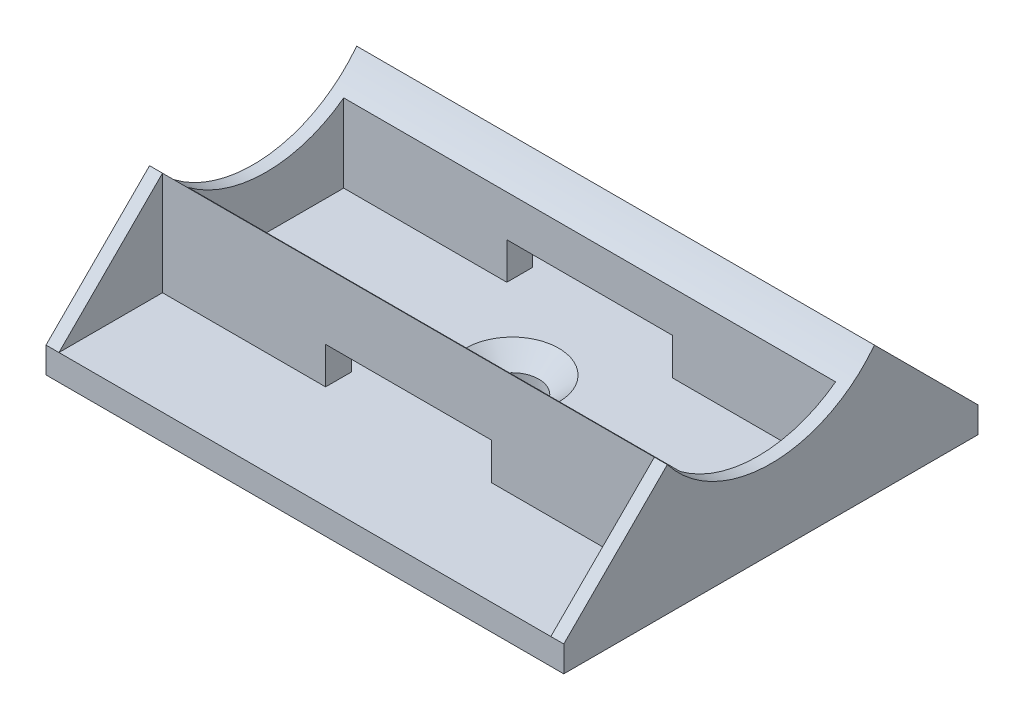
ISO-10303-21;
HEADER;
FILE_DESCRIPTION(('STEP AP214'),'2;1');
FILE_NAME('part.step','',(''),(''),'','','');
FILE_SCHEMA(('AUTOMOTIVE_DESIGN { 1 0 10303 214 1 1 1 1 }'));
ENDSEC;
DATA;
#1=APPLICATION_CONTEXT('core data for automotive mechanical design processes');
#2=APPLICATION_PROTOCOL_DEFINITION('international standard','automotive_design',2000,#1);
#3=PRODUCT_CONTEXT('',#1,'mechanical');
#4=PRODUCT('Part','Part','',(#3));
#5=PRODUCT_RELATED_PRODUCT_CATEGORY('part','',(#4));
#6=PRODUCT_DEFINITION_FORMATION('','',#4);
#7=PRODUCT_DEFINITION_CONTEXT('part definition',#1,'design');
#8=PRODUCT_DEFINITION('design','',#6,#7);
#9=PRODUCT_DEFINITION_SHAPE('','',#8);
#10=(LENGTH_UNIT() NAMED_UNIT(*) SI_UNIT(.MILLI.,.METRE.));
#11=(NAMED_UNIT(*) PLANE_ANGLE_UNIT() SI_UNIT($,.RADIAN.));
#12=(NAMED_UNIT(*) SI_UNIT($,.STERADIAN.) SOLID_ANGLE_UNIT());
#13=UNCERTAINTY_MEASURE_WITH_UNIT(LENGTH_MEASURE(1.E-05),#10,'distance_accuracy_value','');
#14=(GEOMETRIC_REPRESENTATION_CONTEXT(3) GLOBAL_UNCERTAINTY_ASSIGNED_CONTEXT((#13)) GLOBAL_UNIT_ASSIGNED_CONTEXT((#10,
#11,#12)) REPRESENTATION_CONTEXT('',''));
#15=CARTESIAN_POINT('',(0.,0.,0.));
#16=DIRECTION('',(0.,0.,1.));
#17=DIRECTION('',(1.,0.,0.));
#18=AXIS2_PLACEMENT_3D('',#15,#16,#17);
#19=CARTESIAN_POINT('',(31.75,0.,-19.05));
#20=DIRECTION('',(0.,0.,-1.));
#21=DIRECTION('',(-1.,0.,0.));
#22=AXIS2_PLACEMENT_3D('',#19,#20,#21);
#23=PLANE('',#22);
#24=DIRECTION('',(0.,-1.,0.));
#25=VECTOR('',#24,1.);
#26=CARTESIAN_POINT('',(20.955,0.,-19.05));
#27=LINE('',#26,#25);
#28=CARTESIAN_POINT('',(20.955,3.8479761961554,-19.05));
#29=VERTEX_POINT('',#28);
#30=CARTESIAN_POINT('',(20.955,1.5875,-19.05));
#31=VERTEX_POINT('',#30);
#32=EDGE_CURVE('E423',#29,#31,#27,.T.);
#33=ORIENTED_EDGE('',*,*,#32,.F.);
#34=DIRECTION('',(1.,0.,0.));
#35=VECTOR('',#34,1.);
#36=CARTESIAN_POINT('',(31.75,3.8479761961554,-19.05));
#37=LINE('',#36,#35);
#38=CARTESIAN_POINT('',(10.795,3.8479761961554,-19.05));
#39=VERTEX_POINT('',#38);
#40=EDGE_CURVE('E409',#39,#29,#37,.T.);
#41=ORIENTED_EDGE('',*,*,#40,.F.);
#42=DIRECTION('',(0.,1.,0.));
#43=VECTOR('',#42,1.);
#44=CARTESIAN_POINT('',(10.795,0.,-19.05));
#45=LINE('',#44,#43);
#46=CARTESIAN_POINT('',(10.795,1.5875,-19.05));
#47=VERTEX_POINT('',#46);
#48=EDGE_CURVE('E417',#47,#39,#45,.T.);
#49=ORIENTED_EDGE('',*,*,#48,.F.);
#50=DIRECTION('',(-1.,0.,0.));
#51=VECTOR('',#50,1.);
#52=CARTESIAN_POINT('',(31.75,1.5875,-19.05));
#53=LINE('',#52,#51);
#54=CARTESIAN_POINT('',(0.79375,1.5875,-19.05));
#55=VERTEX_POINT('',#54);
#56=EDGE_CURVE('E216',#47,#55,#53,.T.);
#57=ORIENTED_EDGE('',*,*,#56,.T.);
#58=DIRECTION('',(0.,-1.,0.));
#59=VECTOR('',#58,1.);
#60=CARTESIAN_POINT('',(0.793749999999999,0.,-19.05));
#61=LINE('',#60,#59);
#62=CARTESIAN_POINT('',(0.793749999999999,7.9375,-19.05));
#63=VERTEX_POINT('',#62);
#64=EDGE_CURVE('E223',#63,#55,#61,.T.);
#65=ORIENTED_EDGE('',*,*,#64,.F.);
#66=DIRECTION('',(-1.,0.,0.));
#67=VECTOR('',#66,1.);
#68=CARTESIAN_POINT('',(31.75,7.9375,-19.05));
#69=LINE('',#68,#67);
#70=CARTESIAN_POINT('',(30.95625,7.9375,-19.05));
#71=VERTEX_POINT('',#70);
#72=EDGE_CURVE('E217',#71,#63,#69,.T.);
#73=ORIENTED_EDGE('',*,*,#72,.F.);
#74=DIRECTION('',(0.,-1.,0.));
#75=VECTOR('',#74,1.);
#76=CARTESIAN_POINT('',(30.95625,7.9375,-19.05));
#77=LINE('',#76,#75);
#78=CARTESIAN_POINT('',(30.95625,1.5875,-19.05));
#79=VERTEX_POINT('',#78);
#80=EDGE_CURVE('E225',#71,#79,#77,.T.);
#81=ORIENTED_EDGE('',*,*,#80,.T.);
#82=EDGE_CURVE('E285',#79,#31,#53,.T.);
#83=ORIENTED_EDGE('',*,*,#82,.T.);
#84=EDGE_LOOP('',(#33,#41,#49,#57,#65,#73,#81,#83));
#85=FACE_BOUND('',#84,.T.);
#86=ADVANCED_FACE('F34',(#85),#23,.T.);
#87=CARTESIAN_POINT('',(31.75,0.,0.));
#88=DIRECTION('',(0.,1.,0.));
#89=DIRECTION('',(0.,0.,1.));
#90=AXIS2_PLACEMENT_3D('',#87,#88,#89);
#91=PLANE('',#90);
#92=CARTESIAN_POINT('',(15.8872826689596,0.,-12.6977701780433));
#93=DIRECTION('',(0.,1.,0.));
#94=DIRECTION('',(0.,0.,1.));
#95=AXIS2_PLACEMENT_3D('',#92,#93,#94);
#96=CIRCLE('',#95,1.63195);
#97=CARTESIAN_POINT('',(15.8872826689596,0.,-11.0658201780433));
#98=VERTEX_POINT('',#97);
#99=EDGE_CURVE('E206',#98,#98,#96,.T.);
#100=ORIENTED_EDGE('',*,*,#99,.T.);
#101=EDGE_LOOP('',(#100));
#102=FACE_BOUND('',#101,.T.);
#103=DIRECTION('',(0.,0.,-1.));
#104=VECTOR('',#103,1.);
#105=CARTESIAN_POINT('',(0.,0.,0.));
#106=LINE('',#105,#104);
#107=CARTESIAN_POINT('',(0.,0.,0.));
#108=VERTEX_POINT('',#107);
#109=CARTESIAN_POINT('',(0.,0.,-25.4));
#110=VERTEX_POINT('',#109);
#111=EDGE_CURVE('E250',#108,#110,#106,.T.);
#112=ORIENTED_EDGE('',*,*,#111,.T.);
#113=DIRECTION('',(-1.,0.,0.));
#114=VECTOR('',#113,1.);
#115=CARTESIAN_POINT('',(31.75,0.,-25.4));
#116=LINE('',#115,#114);
#117=CARTESIAN_POINT('',(31.75,0.,-25.4));
#118=VERTEX_POINT('',#117);
#119=EDGE_CURVE('E11',#118,#110,#116,.T.);
#120=ORIENTED_EDGE('',*,*,#119,.F.);
#121=DIRECTION('',(0.,0.,-1.));
#122=VECTOR('',#121,1.);
#123=CARTESIAN_POINT('',(31.75,0.,0.));
#124=LINE('',#123,#122);
#125=CARTESIAN_POINT('',(31.75,0.,0.));
#126=VERTEX_POINT('',#125);
#127=EDGE_CURVE('E252',#126,#118,#124,.T.);
#128=ORIENTED_EDGE('',*,*,#127,.F.);
#129=DIRECTION('',(-1.,0.,0.));
#130=VECTOR('',#129,1.);
#131=CARTESIAN_POINT('',(31.75,0.,0.));
#132=LINE('',#131,#130);
#133=EDGE_CURVE('E258',#126,#108,#132,.T.);
#134=ORIENTED_EDGE('',*,*,#133,.T.);
#135=EDGE_LOOP('',(#112,#120,#128,#134));
#136=FACE_BOUND('',#135,.T.);
#137=ADVANCED_FACE('F36',(#102,#136),#91,.F.);
#138=CARTESIAN_POINT('',(31.75,0.,-25.4));
#139=DIRECTION('',(0.,0.,1.));
#140=DIRECTION('',(1.,0.,0.));
#141=AXIS2_PLACEMENT_3D('',#138,#139,#140);
#142=PLANE('',#141);
#143=DIRECTION('',(0.,1.,0.));
#144=VECTOR('',#143,1.);
#145=CARTESIAN_POINT('',(0.,0.,-25.4));
#146=LINE('',#145,#144);
#147=CARTESIAN_POINT('',(0.,1.5875,-25.4));
#148=VERTEX_POINT('',#147);
#149=EDGE_CURVE('E261',#110,#148,#146,.T.);
#150=ORIENTED_EDGE('',*,*,#149,.T.);
#151=DIRECTION('',(-1.,0.,0.));
#152=VECTOR('',#151,1.);
#153=CARTESIAN_POINT('',(0.79375,1.5875,-25.4));
#154=LINE('',#153,#152);
#155=CARTESIAN_POINT('',(0.79375,1.5875,-25.4));
#156=VERTEX_POINT('',#155);
#157=EDGE_CURVE('E315',#156,#148,#154,.T.);
#158=ORIENTED_EDGE('',*,*,#157,.F.);
#159=DIRECTION('',(-1.,0.,0.));
#160=VECTOR('',#159,1.);
#161=CARTESIAN_POINT('',(31.75,1.5875,-25.4));
#162=LINE('',#161,#160);
#163=CARTESIAN_POINT('',(30.95625,1.5875,-25.4));
#164=VERTEX_POINT('',#163);
#165=EDGE_CURVE('E287',#164,#156,#162,.T.);
#166=ORIENTED_EDGE('',*,*,#165,.F.);
#167=CARTESIAN_POINT('',(31.75,1.5875,-25.4));
#168=VERTEX_POINT('',#167);
#169=EDGE_CURVE('E42',#168,#164,#162,.T.);
#170=ORIENTED_EDGE('',*,*,#169,.F.);
#171=DIRECTION('',(0.,1.,0.));
#172=VECTOR('',#171,1.);
#173=CARTESIAN_POINT('',(31.75,0.,-25.4));
#174=LINE('',#173,#172);
#175=EDGE_CURVE('E221',#118,#168,#174,.T.);
#176=ORIENTED_EDGE('',*,*,#175,.F.);
#177=ORIENTED_EDGE('',*,*,#119,.T.);
#178=EDGE_LOOP('',(#150,#158,#166,#170,#176,#177));
#179=FACE_BOUND('',#178,.T.);
#180=ADVANCED_FACE('F319',(#179),#142,.F.);
#181=CARTESIAN_POINT('',(31.75,0.,-17.4625));
#182=DIRECTION('',(0.,0.,-1.));
#183=DIRECTION('',(-1.,0.,0.));
#184=AXIS2_PLACEMENT_3D('',#181,#182,#183);
#185=PLANE('',#184);
#186=DIRECTION('',(0.,1.,0.));
#187=VECTOR('',#186,1.);
#188=CARTESIAN_POINT('',(30.95625,7.9375,-17.4625));
#189=LINE('',#188,#187);
#190=CARTESIAN_POINT('',(30.95625,1.5875,-17.4625));
#191=VERTEX_POINT('',#190);
#192=CARTESIAN_POINT('',(30.95625,6.3799587571638,-17.4625));
#193=VERTEX_POINT('',#192);
#194=EDGE_CURVE('E238',#191,#193,#189,.T.);
#195=ORIENTED_EDGE('',*,*,#194,.T.);
#196=DIRECTION('',(1.,0.,0.));
#197=VECTOR('',#196,1.);
#198=CARTESIAN_POINT('',(-0.001000000000001,6.3799587571638,-17.4625));
#199=LINE('',#198,#197);
#200=CARTESIAN_POINT('',(0.79375,6.3799587571638,-17.4625));
#201=VERTEX_POINT('',#200);
#202=EDGE_CURVE('E373',#201,#193,#199,.T.);
#203=ORIENTED_EDGE('',*,*,#202,.F.);
#204=DIRECTION('',(0.,-1.,0.));
#205=VECTOR('',#204,1.);
#206=CARTESIAN_POINT('',(0.793749999999999,0.,-17.4625));
#207=LINE('',#206,#205);
#208=CARTESIAN_POINT('',(0.79375,1.5875,-17.4625));
#209=VERTEX_POINT('',#208);
#210=EDGE_CURVE('E228',#201,#209,#207,.T.);
#211=ORIENTED_EDGE('',*,*,#210,.T.);
#212=DIRECTION('',(-1.,0.,0.));
#213=VECTOR('',#212,1.);
#214=CARTESIAN_POINT('',(31.75,1.5875,-17.4625));
#215=LINE('',#214,#213);
#216=CARTESIAN_POINT('',(10.795,1.5875,-17.4625));
#217=VERTEX_POINT('',#216);
#218=EDGE_CURVE('E281',#217,#209,#215,.T.);
#219=ORIENTED_EDGE('',*,*,#218,.F.);
#220=DIRECTION('',(0.,1.,0.));
#221=VECTOR('',#220,1.);
#222=CARTESIAN_POINT('',(10.795,0.,-17.4625));
#223=LINE('',#222,#221);
#224=CARTESIAN_POINT('',(10.795,3.8479761961554,-17.4625));
#225=VERTEX_POINT('',#224);
#226=EDGE_CURVE('E414',#217,#225,#223,.T.);
#227=ORIENTED_EDGE('',*,*,#226,.T.);
#228=DIRECTION('',(1.,0.,0.));
#229=VECTOR('',#228,1.);
#230=CARTESIAN_POINT('',(31.75,3.8479761961554,-17.4625));
#231=LINE('',#230,#229);
#232=CARTESIAN_POINT('',(20.955,3.8479761961554,-17.4625));
#233=VERTEX_POINT('',#232);
#234=EDGE_CURVE('E406',#225,#233,#231,.T.);
#235=ORIENTED_EDGE('',*,*,#234,.T.);
#236=DIRECTION('',(0.,-1.,0.));
#237=VECTOR('',#236,1.);
#238=CARTESIAN_POINT('',(20.955,0.,-17.4625));
#239=LINE('',#238,#237);
#240=CARTESIAN_POINT('',(20.955,1.5875,-17.4625));
#241=VERTEX_POINT('',#240);
#242=EDGE_CURVE('E421',#233,#241,#239,.T.);
#243=ORIENTED_EDGE('',*,*,#242,.T.);
#244=EDGE_CURVE('E282',#191,#241,#215,.T.);
#245=ORIENTED_EDGE('',*,*,#244,.F.);
#246=EDGE_LOOP('',(#195,#203,#211,#219,#227,#235,#243,#245));
#247=FACE_BOUND('',#246,.T.);
#248=ADVANCED_FACE('F357',(#247),#185,.F.);
#249=CARTESIAN_POINT('',(31.75,0.,-7.9375));
#250=DIRECTION('',(0.,0.,-1.));
#251=DIRECTION('',(-1.,0.,0.));
#252=AXIS2_PLACEMENT_3D('',#249,#250,#251);
#253=PLANE('',#252);
#254=DIRECTION('',(1.,0.,0.));
#255=VECTOR('',#254,1.);
#256=CARTESIAN_POINT('',(-0.001000000000001,6.3799587571638,-7.9375));
#257=LINE('',#256,#255);
#258=CARTESIAN_POINT('',(0.79375,6.3799587571638,-7.9375));
#259=VERTEX_POINT('',#258);
#260=CARTESIAN_POINT('',(30.95625,6.3799587571638,-7.9375));
#261=VERTEX_POINT('',#260);
#262=EDGE_CURVE('E49',#259,#261,#257,.T.);
#263=ORIENTED_EDGE('',*,*,#262,.T.);
#264=DIRECTION('',(0.,-1.,0.));
#265=VECTOR('',#264,1.);
#266=CARTESIAN_POINT('',(30.95625,1.5875,-7.9375));
#267=LINE('',#266,#265);
#268=CARTESIAN_POINT('',(30.95625,1.5875,-7.9375));
#269=VERTEX_POINT('',#268);
#270=EDGE_CURVE('E234',#261,#269,#267,.T.);
#271=ORIENTED_EDGE('',*,*,#270,.T.);
#272=DIRECTION('',(-1.,0.,0.));
#273=VECTOR('',#272,1.);
#274=CARTESIAN_POINT('',(31.75,1.5875,-7.9375));
#275=LINE('',#274,#273);
#276=CARTESIAN_POINT('',(20.955,1.5875,-7.9375));
#277=VERTEX_POINT('',#276);
#278=EDGE_CURVE('E278',#269,#277,#275,.T.);
#279=ORIENTED_EDGE('',*,*,#278,.T.);
#280=DIRECTION('',(0.,-1.,0.));
#281=VECTOR('',#280,1.);
#282=CARTESIAN_POINT('',(20.955,0.,-7.9375));
#283=LINE('',#282,#281);
#284=CARTESIAN_POINT('',(20.955,3.8479761961554,-7.9375));
#285=VERTEX_POINT('',#284);
#286=EDGE_CURVE('E419',#285,#277,#283,.T.);
#287=ORIENTED_EDGE('',*,*,#286,.F.);
#288=DIRECTION('',(1.,0.,0.));
#289=VECTOR('',#288,1.);
#290=CARTESIAN_POINT('',(31.75,3.8479761961554,-7.9375));
#291=LINE('',#290,#289);
#292=CARTESIAN_POINT('',(10.795,3.8479761961554,-7.9375));
#293=VERTEX_POINT('',#292);
#294=EDGE_CURVE('E404',#293,#285,#291,.T.);
#295=ORIENTED_EDGE('',*,*,#294,.F.);
#296=DIRECTION('',(0.,1.,0.));
#297=VECTOR('',#296,1.);
#298=CARTESIAN_POINT('',(10.795,0.,-7.9375));
#299=LINE('',#298,#297);
#300=CARTESIAN_POINT('',(10.795,1.5875,-7.9375));
#301=VERTEX_POINT('',#300);
#302=EDGE_CURVE('E411',#301,#293,#299,.T.);
#303=ORIENTED_EDGE('',*,*,#302,.F.);
#304=CARTESIAN_POINT('',(0.79375,1.5875,-7.9375));
#305=VERTEX_POINT('',#304);
#306=EDGE_CURVE('E277',#301,#305,#275,.T.);
#307=ORIENTED_EDGE('',*,*,#306,.T.);
#308=DIRECTION('',(0.,-1.,0.));
#309=VECTOR('',#308,1.);
#310=CARTESIAN_POINT('',(0.793749999999999,0.,-7.9375));
#311=LINE('',#310,#309);
#312=EDGE_CURVE('E332',#259,#305,#311,.T.);
#313=ORIENTED_EDGE('',*,*,#312,.F.);
#314=EDGE_LOOP('',(#263,#271,#279,#287,#295,#303,#307,#313));
#315=FACE_BOUND('',#314,.T.);
#316=ADVANCED_FACE('F363',(#315),#253,.T.);
#317=CARTESIAN_POINT('',(31.75,0.,-6.35));
#318=DIRECTION('',(0.,0.,-1.));
#319=DIRECTION('',(0.,1.,0.));
#320=AXIS2_PLACEMENT_3D('',#317,#318,#319);
#321=PLANE('',#320);
#322=DIRECTION('',(-1.,0.,0.));
#323=VECTOR('',#322,1.);
#324=CARTESIAN_POINT('',(20.955,3.8479761961554,-6.35));
#325=LINE('',#324,#323);
#326=CARTESIAN_POINT('',(20.955,3.8479761961554,-6.35));
#327=VERTEX_POINT('',#326);
#328=CARTESIAN_POINT('',(10.795,3.8479761961554,-6.35));
#329=VERTEX_POINT('',#328);
#330=EDGE_CURVE('E384',#327,#329,#325,.T.);
#331=ORIENTED_EDGE('',*,*,#330,.F.);
#332=DIRECTION('',(0.,1.,0.));
#333=VECTOR('',#332,1.);
#334=CARTESIAN_POINT('',(20.955,1.5875,-6.35));
#335=LINE('',#334,#333);
#336=CARTESIAN_POINT('',(20.955,1.5875,-6.35));
#337=VERTEX_POINT('',#336);
#338=EDGE_CURVE('E381',#337,#327,#335,.T.);
#339=ORIENTED_EDGE('',*,*,#338,.F.);
#340=DIRECTION('',(-1.,0.,0.));
#341=VECTOR('',#340,1.);
#342=CARTESIAN_POINT('',(31.75,1.5875,-6.35));
#343=LINE('',#342,#341);
#344=CARTESIAN_POINT('',(30.95625,1.5875,-6.35));
#345=VERTEX_POINT('',#344);
#346=EDGE_CURVE('E272',#345,#337,#343,.T.);
#347=ORIENTED_EDGE('',*,*,#346,.F.);
#348=DIRECTION('',(0.,1.,0.));
#349=VECTOR('',#348,1.);
#350=CARTESIAN_POINT('',(30.95625,1.5875,-6.35));
#351=LINE('',#350,#349);
#352=CARTESIAN_POINT('',(30.95625,7.9375,-6.35));
#353=VERTEX_POINT('',#352);
#354=EDGE_CURVE('E242',#345,#353,#351,.T.);
#355=ORIENTED_EDGE('',*,*,#354,.T.);
#356=DIRECTION('',(-1.,0.,0.));
#357=VECTOR('',#356,1.);
#358=CARTESIAN_POINT('',(31.75,7.9375,-6.35));
#359=LINE('',#358,#357);
#360=CARTESIAN_POINT('',(0.793749999999999,7.9375,-6.35));
#361=VERTEX_POINT('',#360);
#362=EDGE_CURVE('E275',#353,#361,#359,.T.);
#363=ORIENTED_EDGE('',*,*,#362,.T.);
#364=DIRECTION('',(0.,-1.,0.));
#365=VECTOR('',#364,1.);
#366=CARTESIAN_POINT('',(0.793749999999999,0.,-6.35));
#367=LINE('',#366,#365);
#368=CARTESIAN_POINT('',(0.79375,1.5875,-6.35));
#369=VERTEX_POINT('',#368);
#370=EDGE_CURVE('E329',#361,#369,#367,.T.);
#371=ORIENTED_EDGE('',*,*,#370,.T.);
#372=CARTESIAN_POINT('',(10.795,1.5875,-6.35));
#373=VERTEX_POINT('',#372);
#374=EDGE_CURVE('E271',#373,#369,#343,.T.);
#375=ORIENTED_EDGE('',*,*,#374,.F.);
#376=DIRECTION('',(0.,-1.,0.));
#377=VECTOR('',#376,1.);
#378=CARTESIAN_POINT('',(10.795,1.5875,-6.35));
#379=LINE('',#378,#377);
#380=EDGE_CURVE('E391',#329,#373,#379,.T.);
#381=ORIENTED_EDGE('',*,*,#380,.F.);
#382=EDGE_LOOP('',(#331,#339,#347,#355,#363,#371,#375,#381));
#383=FACE_BOUND('',#382,.T.);
#384=ADVANCED_FACE('F368',(#383),#321,.F.);
#385=CARTESIAN_POINT('',(31.75,1.5875,0.));
#386=DIRECTION('',(0.,1.,0.));
#387=DIRECTION('',(0.,0.,1.));
#388=AXIS2_PLACEMENT_3D('',#385,#386,#387);
#389=PLANE('',#388);
#390=CARTESIAN_POINT('',(15.8872826689596,1.5875,-12.6977701780433));
#391=DIRECTION('',(0.,1.,0.));
#392=DIRECTION('',(0.,0.,1.));
#393=AXIS2_PLACEMENT_3D('',#390,#391,#392);
#394=CIRCLE('',#393,2.8575);
#395=CARTESIAN_POINT('',(15.8872826689596,1.5875,-9.8402701780433));
#396=VERTEX_POINT('',#395);
#397=EDGE_CURVE('E488',#396,#396,#394,.T.);
#398=ORIENTED_EDGE('',*,*,#397,.F.);
#399=EDGE_LOOP('',(#398));
#400=FACE_BOUND('',#399,.T.);
#401=DIRECTION('',(0.,0.,1.));
#402=VECTOR('',#401,1.);
#403=CARTESIAN_POINT('',(0.79375,1.5875,-25.4));
#404=LINE('',#403,#402);
#405=CARTESIAN_POINT('',(0.79375,1.5875,0.));
#406=VERTEX_POINT('',#405);
#407=EDGE_CURVE('E309',#369,#406,#404,.T.);
#408=ORIENTED_EDGE('',*,*,#407,.T.);
#409=DIRECTION('',(-1.,0.,0.));
#410=VECTOR('',#409,1.);
#411=CARTESIAN_POINT('',(31.75,1.5875,0.));
#412=LINE('',#411,#410);
#413=CARTESIAN_POINT('',(30.95625,1.5875,0.));
#414=VERTEX_POINT('',#413);
#415=EDGE_CURVE('E267',#414,#406,#412,.T.);
#416=ORIENTED_EDGE('',*,*,#415,.F.);
#417=DIRECTION('',(0.,0.,-1.));
#418=VECTOR('',#417,1.);
#419=CARTESIAN_POINT('',(30.95625,1.5875,0.));
#420=LINE('',#419,#418);
#421=EDGE_CURVE('E248',#414,#345,#420,.T.);
#422=ORIENTED_EDGE('',*,*,#421,.T.);
#423=ORIENTED_EDGE('',*,*,#346,.T.);
#424=DIRECTION('',(0.,0.,1.));
#425=VECTOR('',#424,1.);
#426=CARTESIAN_POINT('',(20.955,1.5875,-25.4));
#427=LINE('',#426,#425);
#428=EDGE_CURVE('E394',#277,#337,#427,.T.);
#429=ORIENTED_EDGE('',*,*,#428,.F.);
#430=ORIENTED_EDGE('',*,*,#278,.F.);
#431=DIRECTION('',(0.,0.,-1.));
#432=VECTOR('',#431,1.);
#433=CARTESIAN_POINT('',(30.95625,1.5875,-17.4625));
#434=LINE('',#433,#432);
#435=EDGE_CURVE('E236',#269,#191,#434,.T.);
#436=ORIENTED_EDGE('',*,*,#435,.T.);
#437=ORIENTED_EDGE('',*,*,#244,.T.);
#438=EDGE_CURVE('E339',#31,#241,#427,.T.);
#439=ORIENTED_EDGE('',*,*,#438,.F.);
#440=ORIENTED_EDGE('',*,*,#82,.F.);
#441=DIRECTION('',(0.,0.,-1.));
#442=VECTOR('',#441,1.);
#443=CARTESIAN_POINT('',(30.95625,1.5875,-19.05));
#444=LINE('',#443,#442);
#445=EDGE_CURVE('E232',#79,#164,#444,.T.);
#446=ORIENTED_EDGE('',*,*,#445,.T.);
#447=ORIENTED_EDGE('',*,*,#165,.T.);
#448=EDGE_CURVE('E295',#156,#55,#404,.T.);
#449=ORIENTED_EDGE('',*,*,#448,.T.);
#450=ORIENTED_EDGE('',*,*,#56,.F.);
#451=DIRECTION('',(0.,0.,1.));
#452=VECTOR('',#451,1.);
#453=CARTESIAN_POINT('',(10.795,1.5875,-25.4));
#454=LINE('',#453,#452);
#455=EDGE_CURVE('E396',#47,#217,#454,.T.);
#456=ORIENTED_EDGE('',*,*,#455,.T.);
#457=ORIENTED_EDGE('',*,*,#218,.T.);
#458=EDGE_CURVE('E307',#209,#305,#404,.T.);
#459=ORIENTED_EDGE('',*,*,#458,.T.);
#460=ORIENTED_EDGE('',*,*,#306,.F.);
#461=EDGE_CURVE('E397',#301,#373,#454,.T.);
#462=ORIENTED_EDGE('',*,*,#461,.T.);
#463=ORIENTED_EDGE('',*,*,#374,.T.);
#464=EDGE_LOOP('',(#408,#416,#422,#423,#429,#430,#436,#437,#439,#440,#446,#447,#449,#450,#456,
#457,#459,#460,#462,#463));
#465=FACE_BOUND('',#464,.T.);
#466=ADVANCED_FACE('F293',(#400,#465),#389,.T.);
#467=CARTESIAN_POINT('',(31.75,0.,0.));
#468=DIRECTION('',(0.,0.,1.));
#469=DIRECTION('',(1.,0.,0.));
#470=AXIS2_PLACEMENT_3D('',#467,#468,#469);
#471=PLANE('',#470);
#472=DIRECTION('',(0.,1.,0.));
#473=VECTOR('',#472,1.);
#474=CARTESIAN_POINT('',(0.,0.,0.));
#475=LINE('',#474,#473);
#476=CARTESIAN_POINT('',(0.,1.5875,0.));
#477=VERTEX_POINT('',#476);
#478=EDGE_CURVE('E254',#108,#477,#475,.T.);
#479=ORIENTED_EDGE('',*,*,#478,.F.);
#480=ORIENTED_EDGE('',*,*,#133,.F.);
#481=DIRECTION('',(0.,1.,0.));
#482=VECTOR('',#481,1.);
#483=CARTESIAN_POINT('',(31.75,0.,0.));
#484=LINE('',#483,#482);
#485=CARTESIAN_POINT('',(31.75,1.5875,0.));
#486=VERTEX_POINT('',#485);
#487=EDGE_CURVE('E256',#126,#486,#484,.T.);
#488=ORIENTED_EDGE('',*,*,#487,.T.);
#489=EDGE_CURVE('E268',#486,#414,#412,.T.);
#490=ORIENTED_EDGE('',*,*,#489,.T.);
#491=ORIENTED_EDGE('',*,*,#415,.T.);
#492=DIRECTION('',(-1.,0.,0.));
#493=VECTOR('',#492,1.);
#494=CARTESIAN_POINT('',(0.79375,1.5875,0.));
#495=LINE('',#494,#493);
#496=EDGE_CURVE('E320',#406,#477,#495,.T.);
#497=ORIENTED_EDGE('',*,*,#496,.T.);
#498=EDGE_LOOP('',(#479,#480,#488,#490,#491,#497));
#499=FACE_BOUND('',#498,.T.);
#500=ADVANCED_FACE('F441',(#499),#471,.T.);
#501=CARTESIAN_POINT('',(31.75,0.,0.));
#502=DIRECTION('',(1.,0.,0.));
#503=DIRECTION('',(0.,0.,-1.));
#504=AXIS2_PLACEMENT_3D('',#501,#502,#503);
#505=PLANE('',#504);
#506=CARTESIAN_POINT('',(31.75,12.8218518901491,-12.7));
#507=DIRECTION('',(1.,0.,0.));
#508=DIRECTION('',(0.,0.,-1.));
#509=AXIS2_PLACEMENT_3D('',#506,#507,#508);
#510=CIRCLE('',#509,8.01120424073701);
#511=CARTESIAN_POINT('',(31.75,7.9375,-6.35));
#512=VERTEX_POINT('',#511);
#513=CARTESIAN_POINT('',(31.75,7.9375,-19.05));
#514=VERTEX_POINT('',#513);
#515=EDGE_CURVE('E194',#512,#514,#510,.T.);
#516=ORIENTED_EDGE('',*,*,#515,.F.);
#517=DIRECTION('',(0.,-0.707106781186547,0.707106781186547));
#518=VECTOR('',#517,1.);
#519=CARTESIAN_POINT('',(31.75,7.9375,-6.35));
#520=LINE('',#519,#518);
#521=EDGE_CURVE('E241',#512,#486,#520,.T.);
#522=ORIENTED_EDGE('',*,*,#521,.T.);
#523=ORIENTED_EDGE('',*,*,#487,.F.);
#524=ORIENTED_EDGE('',*,*,#127,.T.);
#525=ORIENTED_EDGE('',*,*,#175,.T.);
#526=DIRECTION('',(0.,0.707106781186548,0.707106781186547));
#527=VECTOR('',#526,1.);
#528=CARTESIAN_POINT('',(31.75,1.5875,-25.4));
#529=LINE('',#528,#527);
#530=EDGE_CURVE('E213',#168,#514,#529,.T.);
#531=ORIENTED_EDGE('',*,*,#530,.T.);
#532=EDGE_LOOP('',(#516,#522,#523,#524,#525,#531));
#533=FACE_BOUND('',#532,.T.);
#534=ADVANCED_FACE('F219',(#533),#505,.T.);
#535=CARTESIAN_POINT('',(0.,0.,0.));
#536=DIRECTION('',(1.,0.,0.));
#537=DIRECTION('',(0.,0.,-1.));
#538=AXIS2_PLACEMENT_3D('',#535,#536,#537);
#539=PLANE('',#538);
#540=DIRECTION('',(0.,0.707106781186547,-0.707106781186547));
#541=VECTOR('',#540,1.);
#542=CARTESIAN_POINT('',(0.,1.5875,0.));
#543=LINE('',#542,#541);
#544=CARTESIAN_POINT('',(0.,7.9375,-6.35));
#545=VERTEX_POINT('',#544);
#546=EDGE_CURVE('E317',#477,#545,#543,.T.);
#547=ORIENTED_EDGE('',*,*,#546,.T.);
#548=CARTESIAN_POINT('',(0.,12.8218518901491,-12.7));
#549=DIRECTION('',(1.,0.,0.));
#550=DIRECTION('',(0.,0.,-1.));
#551=AXIS2_PLACEMENT_3D('',#548,#549,#550);
#552=CIRCLE('',#551,8.01120424073701);
#553=CARTESIAN_POINT('',(0.,7.9375,-19.05));
#554=VERTEX_POINT('',#553);
#555=EDGE_CURVE('E205',#554,#545,#552,.F.);
#556=ORIENTED_EDGE('',*,*,#555,.F.);
#557=DIRECTION('',(0.,-0.707106781186548,-0.707106781186547));
#558=VECTOR('',#557,1.);
#559=CARTESIAN_POINT('',(0.,7.9375,-19.05));
#560=LINE('',#559,#558);
#561=EDGE_CURVE('E424',#554,#148,#560,.T.);
#562=ORIENTED_EDGE('',*,*,#561,.T.);
#563=ORIENTED_EDGE('',*,*,#149,.F.);
#564=ORIENTED_EDGE('',*,*,#111,.F.);
#565=ORIENTED_EDGE('',*,*,#478,.T.);
#566=EDGE_LOOP('',(#547,#556,#562,#563,#564,#565));
#567=FACE_BOUND('',#566,.T.);
#568=ADVANCED_FACE('F437',(#567),#539,.F.);
#569=CARTESIAN_POINT('',(30.95625,7.9375,-6.35));
#570=DIRECTION('',(0.,0.707106781186548,0.707106781186548));
#571=DIRECTION('',(0.,-0.707106781186548,0.707106781186548));
#572=AXIS2_PLACEMENT_3D('',#569,#570,#571);
#573=PLANE('',#572);
#574=ORIENTED_EDGE('',*,*,#521,.F.);
#575=EDGE_CURVE('E200',#512,#353,#359,.T.);
#576=ORIENTED_EDGE('',*,*,#575,.T.);
#577=DIRECTION('',(0.,-0.707106781186547,0.707106781186547));
#578=VECTOR('',#577,1.);
#579=CARTESIAN_POINT('',(30.95625,7.9375,-6.35));
#580=LINE('',#579,#578);
#581=EDGE_CURVE('E245',#353,#414,#580,.T.);
#582=ORIENTED_EDGE('',*,*,#581,.T.);
#583=ORIENTED_EDGE('',*,*,#489,.F.);
#584=EDGE_LOOP('',(#574,#576,#582,#583));
#585=FACE_BOUND('',#584,.T.);
#586=ADVANCED_FACE('F474',(#585),#573,.T.);
#587=CARTESIAN_POINT('',(30.95625,0.,0.));
#588=DIRECTION('',(-1.,0.,0.));
#589=DIRECTION('',(0.,0.,1.));
#590=AXIS2_PLACEMENT_3D('',#587,#588,#589);
#591=PLANE('',#590);
#592=ORIENTED_EDGE('',*,*,#354,.F.);
#593=ORIENTED_EDGE('',*,*,#421,.F.);
#594=ORIENTED_EDGE('',*,*,#581,.F.);
#595=EDGE_LOOP('',(#592,#593,#594));
#596=FACE_BOUND('',#595,.T.);
#597=ADVANCED_FACE('F476',(#596),#591,.T.);
#598=CARTESIAN_POINT('',(30.95625,0.,0.));
#599=DIRECTION('',(-1.,0.,0.));
#600=DIRECTION('',(0.,0.,1.));
#601=AXIS2_PLACEMENT_3D('',#598,#599,#600);
#602=PLANE('',#601);
#603=CARTESIAN_POINT('',(30.95625,12.8218518901491,-12.7));
#604=DIRECTION('',(-1.,0.,0.));
#605=DIRECTION('',(0.,0.,1.));
#606=AXIS2_PLACEMENT_3D('',#603,#604,#605);
#607=CIRCLE('',#606,8.01120424073701);
#608=EDGE_CURVE('E380',#261,#193,#607,.F.);
#609=ORIENTED_EDGE('',*,*,#608,.T.);
#610=ORIENTED_EDGE('',*,*,#194,.F.);
#611=ORIENTED_EDGE('',*,*,#435,.F.);
#612=ORIENTED_EDGE('',*,*,#270,.F.);
#613=EDGE_LOOP('',(#609,#610,#611,#612));
#614=FACE_BOUND('',#613,.T.);
#615=ADVANCED_FACE('F348',(#614),#602,.T.);
#616=CARTESIAN_POINT('',(30.95625,1.5875,-25.4));
#617=DIRECTION('',(0.,0.707106781186547,-0.707106781186548));
#618=DIRECTION('',(0.,0.707106781186548,0.707106781186547));
#619=AXIS2_PLACEMENT_3D('',#616,#617,#618);
#620=PLANE('',#619);
#621=ORIENTED_EDGE('',*,*,#530,.F.);
#622=ORIENTED_EDGE('',*,*,#169,.T.);
#623=DIRECTION('',(0.,0.707106781186548,0.707106781186547));
#624=VECTOR('',#623,1.);
#625=CARTESIAN_POINT('',(30.95625,1.5875,-25.4));
#626=LINE('',#625,#624);
#627=EDGE_CURVE('E215',#164,#71,#626,.T.);
#628=ORIENTED_EDGE('',*,*,#627,.T.);
#629=EDGE_CURVE('E197',#514,#71,#69,.T.);
#630=ORIENTED_EDGE('',*,*,#629,.F.);
#631=EDGE_LOOP('',(#621,#622,#628,#630));
#632=FACE_BOUND('',#631,.T.);
#633=ADVANCED_FACE('F211',(#632),#620,.T.);
#634=CARTESIAN_POINT('',(30.95625,0.,0.));
#635=DIRECTION('',(1.,0.,0.));
#636=DIRECTION('',(0.,0.,-1.));
#637=AXIS2_PLACEMENT_3D('',#634,#635,#636);
#638=PLANE('',#637);
#639=ORIENTED_EDGE('',*,*,#627,.F.);
#640=ORIENTED_EDGE('',*,*,#445,.F.);
#641=ORIENTED_EDGE('',*,*,#80,.F.);
#642=EDGE_LOOP('',(#639,#640,#641));
#643=FACE_BOUND('',#642,.T.);
#644=ADVANCED_FACE('F340',(#643),#638,.F.);
#645=CARTESIAN_POINT('',(0.79375,7.9375,-19.05));
#646=DIRECTION('',(0.,0.707106781186547,-0.707106781186548));
#647=DIRECTION('',(0.,0.707106781186548,0.707106781186547));
#648=AXIS2_PLACEMENT_3D('',#645,#646,#647);
#649=PLANE('',#648);
#650=ORIENTED_EDGE('',*,*,#561,.F.);
#651=DIRECTION('',(-1.,0.,0.));
#652=VECTOR('',#651,1.);
#653=CARTESIAN_POINT('',(0.79375,7.9375,-19.05));
#654=LINE('',#653,#652);
#655=EDGE_CURVE('E316',#63,#554,#654,.T.);
#656=ORIENTED_EDGE('',*,*,#655,.F.);
#657=DIRECTION('',(0.,-0.707106781186548,-0.707106781186547));
#658=VECTOR('',#657,1.);
#659=CARTESIAN_POINT('',(0.79375,7.9375,-19.05));
#660=LINE('',#659,#658);
#661=EDGE_CURVE('E304',#63,#156,#660,.T.);
#662=ORIENTED_EDGE('',*,*,#661,.T.);
#663=ORIENTED_EDGE('',*,*,#157,.T.);
#664=EDGE_LOOP('',(#650,#656,#662,#663));
#665=FACE_BOUND('',#664,.T.);
#666=ADVANCED_FACE('F314',(#665),#649,.T.);
#667=CARTESIAN_POINT('',(0.79375,0.,0.));
#668=DIRECTION('',(1.,0.,0.));
#669=DIRECTION('',(0.,0.,-1.));
#670=AXIS2_PLACEMENT_3D('',#667,#668,#669);
#671=PLANE('',#670);
#672=ORIENTED_EDGE('',*,*,#661,.F.);
#673=ORIENTED_EDGE('',*,*,#64,.T.);
#674=ORIENTED_EDGE('',*,*,#448,.F.);
#675=EDGE_LOOP('',(#672,#673,#674));
#676=FACE_BOUND('',#675,.T.);
#677=ADVANCED_FACE('F303',(#676),#671,.T.);
#678=CARTESIAN_POINT('',(0.79375,12.8218518901491,-12.7));
#679=DIRECTION('',(1.,0.,0.));
#680=DIRECTION('',(0.,0.,-1.));
#681=AXIS2_PLACEMENT_3D('',#678,#679,#680);
#682=CIRCLE('',#681,8.01120424073701);
#683=EDGE_CURVE('E458',#201,#259,#682,.F.);
#684=ORIENTED_EDGE('',*,*,#683,.T.);
#685=ORIENTED_EDGE('',*,*,#312,.T.);
#686=ORIENTED_EDGE('',*,*,#458,.F.);
#687=ORIENTED_EDGE('',*,*,#210,.F.);
#688=EDGE_LOOP('',(#684,#685,#686,#687));
#689=FACE_BOUND('',#688,.T.);
#690=ADVANCED_FACE('F456',(#689),#671,.T.);
#691=ORIENTED_EDGE('',*,*,#370,.F.);
#692=DIRECTION('',(0.,0.707106781186547,-0.707106781186547));
#693=VECTOR('',#692,1.);
#694=CARTESIAN_POINT('',(0.79375,1.5875,0.));
#695=LINE('',#694,#693);
#696=EDGE_CURVE('E306',#406,#361,#695,.T.);
#697=ORIENTED_EDGE('',*,*,#696,.F.);
#698=ORIENTED_EDGE('',*,*,#407,.F.);
#699=EDGE_LOOP('',(#691,#697,#698));
#700=FACE_BOUND('',#699,.T.);
#701=ADVANCED_FACE('F446',(#700),#671,.T.);
#702=CARTESIAN_POINT('',(0.79375,1.5875,0.));
#703=DIRECTION('',(0.,0.707106781186548,0.707106781186548));
#704=DIRECTION('',(0.,-0.707106781186548,0.707106781186548));
#705=AXIS2_PLACEMENT_3D('',#702,#703,#704);
#706=PLANE('',#705);
#707=ORIENTED_EDGE('',*,*,#546,.F.);
#708=ORIENTED_EDGE('',*,*,#496,.F.);
#709=ORIENTED_EDGE('',*,*,#696,.T.);
#710=DIRECTION('',(-1.,0.,0.));
#711=VECTOR('',#710,1.);
#712=CARTESIAN_POINT('',(0.79375,7.9375,-6.35));
#713=LINE('',#712,#711);
#714=EDGE_CURVE('E323',#361,#545,#713,.T.);
#715=ORIENTED_EDGE('',*,*,#714,.T.);
#716=EDGE_LOOP('',(#707,#708,#709,#715));
#717=FACE_BOUND('',#716,.T.);
#718=ADVANCED_FACE('F431',(#717),#706,.T.);
#719=CARTESIAN_POINT('',(20.955,3.8479761961554,-25.4));
#720=DIRECTION('',(0.,1.,0.));
#721=DIRECTION('',(-1.,0.,0.));
#722=AXIS2_PLACEMENT_3D('',#719,#720,#721);
#723=PLANE('',#722);
#724=ORIENTED_EDGE('',*,*,#294,.T.);
#725=DIRECTION('',(0.,0.,1.));
#726=VECTOR('',#725,1.);
#727=CARTESIAN_POINT('',(20.955,3.8479761961554,-25.4));
#728=LINE('',#727,#726);
#729=EDGE_CURVE('E393',#285,#327,#728,.T.);
#730=ORIENTED_EDGE('',*,*,#729,.T.);
#731=ORIENTED_EDGE('',*,*,#330,.T.);
#732=DIRECTION('',(0.,0.,1.));
#733=VECTOR('',#732,1.);
#734=CARTESIAN_POINT('',(10.795,3.8479761961554,-25.4));
#735=LINE('',#734,#733);
#736=EDGE_CURVE('E400',#293,#329,#735,.T.);
#737=ORIENTED_EDGE('',*,*,#736,.F.);
#738=EDGE_LOOP('',(#724,#730,#731,#737));
#739=FACE_BOUND('',#738,.T.);
#740=ADVANCED_FACE('F562',(#739),#723,.F.);
#741=CARTESIAN_POINT('',(10.795,1.5875,-25.4));
#742=DIRECTION('',(-1.,0.,0.));
#743=DIRECTION('',(0.,0.,1.));
#744=AXIS2_PLACEMENT_3D('',#741,#742,#743);
#745=PLANE('',#744);
#746=ORIENTED_EDGE('',*,*,#302,.T.);
#747=ORIENTED_EDGE('',*,*,#736,.T.);
#748=ORIENTED_EDGE('',*,*,#380,.T.);
#749=ORIENTED_EDGE('',*,*,#461,.F.);
#750=EDGE_LOOP('',(#746,#747,#748,#749));
#751=FACE_BOUND('',#750,.T.);
#752=ADVANCED_FACE('F463',(#751),#745,.F.);
#753=CARTESIAN_POINT('',(20.955,1.5875,-25.4));
#754=DIRECTION('',(1.,0.,0.));
#755=DIRECTION('',(0.,0.,-1.));
#756=AXIS2_PLACEMENT_3D('',#753,#754,#755);
#757=PLANE('',#756);
#758=ORIENTED_EDGE('',*,*,#286,.T.);
#759=ORIENTED_EDGE('',*,*,#428,.T.);
#760=ORIENTED_EDGE('',*,*,#338,.T.);
#761=ORIENTED_EDGE('',*,*,#729,.F.);
#762=EDGE_LOOP('',(#758,#759,#760,#761));
#763=FACE_BOUND('',#762,.T.);
#764=ADVANCED_FACE('F615',(#763),#757,.F.);
#765=ORIENTED_EDGE('',*,*,#32,.T.);
#766=ORIENTED_EDGE('',*,*,#438,.T.);
#767=ORIENTED_EDGE('',*,*,#242,.F.);
#768=EDGE_CURVE('E402',#29,#233,#728,.T.);
#769=ORIENTED_EDGE('',*,*,#768,.F.);
#770=EDGE_LOOP('',(#765,#766,#767,#769));
#771=FACE_BOUND('',#770,.T.);
#772=ADVANCED_FACE('F620',(#771),#757,.F.);
#773=ORIENTED_EDGE('',*,*,#48,.T.);
#774=EDGE_CURVE('E57',#39,#225,#735,.T.);
#775=ORIENTED_EDGE('',*,*,#774,.T.);
#776=ORIENTED_EDGE('',*,*,#226,.F.);
#777=ORIENTED_EDGE('',*,*,#455,.F.);
#778=EDGE_LOOP('',(#773,#775,#776,#777));
#779=FACE_BOUND('',#778,.T.);
#780=ADVANCED_FACE('F616',(#779),#745,.F.);
#781=ORIENTED_EDGE('',*,*,#40,.T.);
#782=ORIENTED_EDGE('',*,*,#768,.T.);
#783=ORIENTED_EDGE('',*,*,#234,.F.);
#784=ORIENTED_EDGE('',*,*,#774,.F.);
#785=EDGE_LOOP('',(#781,#782,#783,#784));
#786=FACE_BOUND('',#785,.T.);
#787=ADVANCED_FACE('F574',(#786),#723,.F.);
#788=CARTESIAN_POINT('',(-0.001000000000001,12.8218518901491,-12.7));
#789=DIRECTION('',(1.,0.,0.));
#790=DIRECTION('',(0.,0.,-1.));
#791=AXIS2_PLACEMENT_3D('',#788,#789,#790);
#792=CYLINDRICAL_SURFACE('',#791,8.01120424073701);
#793=ORIENTED_EDGE('',*,*,#262,.F.);
#794=ORIENTED_EDGE('',*,*,#683,.F.);
#795=ORIENTED_EDGE('',*,*,#202,.T.);
#796=ORIENTED_EDGE('',*,*,#608,.F.);
#797=EDGE_LOOP('',(#793,#794,#795,#796));
#798=FACE_BOUND('',#797,.T.);
#799=ORIENTED_EDGE('',*,*,#629,.T.);
#800=ORIENTED_EDGE('',*,*,#72,.T.);
#801=ORIENTED_EDGE('',*,*,#655,.T.);
#802=ORIENTED_EDGE('',*,*,#555,.T.);
#803=ORIENTED_EDGE('',*,*,#714,.F.);
#804=ORIENTED_EDGE('',*,*,#362,.F.);
#805=ORIENTED_EDGE('',*,*,#575,.F.);
#806=ORIENTED_EDGE('',*,*,#515,.T.);
#807=EDGE_LOOP('',(#799,#800,#801,#802,#803,#804,#805,#806));
#808=FACE_BOUND('',#807,.T.);
#809=ADVANCED_FACE('F196',(#798,#808),#792,.F.);
#810=CARTESIAN_POINT('',(15.8872826689596,1.5875,-12.6977701780433));
#811=DIRECTION('',(0.,1.,0.));
#812=DIRECTION('',(0.,0.,1.));
#813=AXIS2_PLACEMENT_3D('',#810,#811,#812);
#814=CYLINDRICAL_SURFACE('',#813,1.63195);
#815=ORIENTED_EDGE('',*,*,#99,.F.);
#816=EDGE_LOOP('',(#815));
#817=FACE_BOUND('',#816,.T.);
#818=CARTESIAN_POINT('',(15.8872826689596,0.559141447010684,-12.6977701780433));
#819=DIRECTION('',(0.,1.,0.));
#820=DIRECTION('',(0.,0.,1.));
#821=AXIS2_PLACEMENT_3D('',#818,#819,#820);
#822=CIRCLE('',#821,1.63195);
#823=CARTESIAN_POINT('',(15.8872826689596,0.559141447010684,-11.0658201780433));
#824=VERTEX_POINT('',#823);
#825=EDGE_CURVE('E485',#824,#824,#822,.T.);
#826=ORIENTED_EDGE('',*,*,#825,.T.);
#827=EDGE_LOOP('',(#826));
#828=FACE_BOUND('',#827,.T.);
#829=ADVANCED_FACE('F573',(#817,#828),#814,.F.);
#830=CARTESIAN_POINT('',(15.8872826689596,1.5875,-12.6977701780433));
#831=DIRECTION('',(0.,1.,0.));
#832=DIRECTION('',(0.,0.,1.));
#833=AXIS2_PLACEMENT_3D('',#830,#831,#832);
#834=CONICAL_SURFACE('',#833,2.8575,0.872664625997164);
#835=ORIENTED_EDGE('',*,*,#825,.F.);
#836=EDGE_LOOP('',(#835));
#837=FACE_BOUND('',#836,.T.);
#838=ORIENTED_EDGE('',*,*,#397,.T.);
#839=EDGE_LOOP('',(#838));
#840=FACE_BOUND('',#839,.T.);
#841=ADVANCED_FACE('F492',(#837,#840),#834,.F.);
#842=CLOSED_SHELL('',(#86,#137,#180,#248,#316,#384,#466,#500,#534,#568,#586,#597,#615,#633,#644,
#666,#677,#690,#701,#718,#740,#752,#764,#772,#780,#787,#809,#829,#841));
#843=MANIFOLD_SOLID_BREP('B2',#842);
#844=ADVANCED_BREP_SHAPE_REPRESENTATION('',(#18,#843),#14);
#845=SHAPE_DEFINITION_REPRESENTATION(#9,#844);
ENDSEC;
END-ISO-10303-21;
